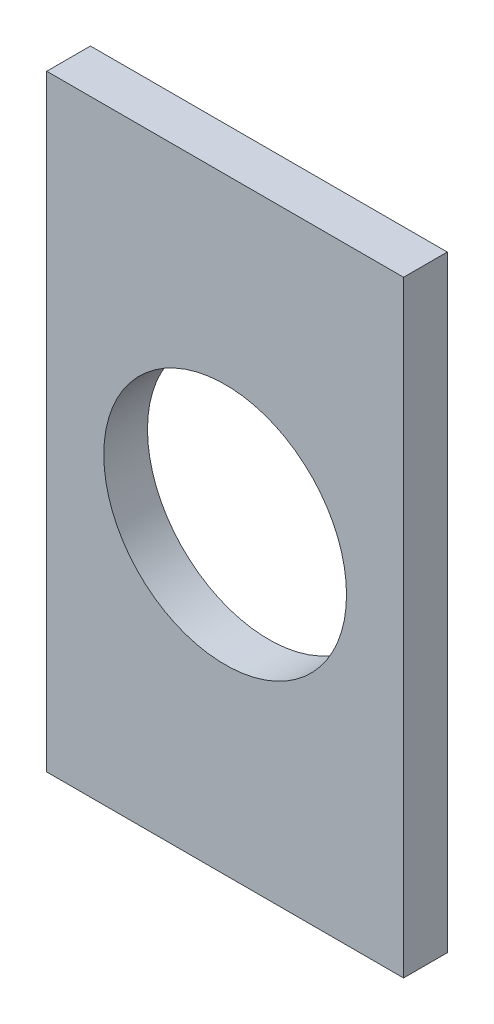
ISO-10303-21;
HEADER;
FILE_DESCRIPTION(('STEP AP214'),'2;1');
FILE_NAME('part.step','',(''),(''),'','','');
FILE_SCHEMA(('AUTOMOTIVE_DESIGN { 1 0 10303 214 1 1 1 1 }'));
ENDSEC;
DATA;
#1=APPLICATION_CONTEXT('core data for automotive mechanical design processes');
#2=APPLICATION_PROTOCOL_DEFINITION('international standard','automotive_design',2000,#1);
#3=PRODUCT_CONTEXT('',#1,'mechanical');
#4=PRODUCT('Part','Part','',(#3));
#5=PRODUCT_RELATED_PRODUCT_CATEGORY('part','',(#4));
#6=PRODUCT_DEFINITION_FORMATION('','',#4);
#7=PRODUCT_DEFINITION_CONTEXT('part definition',#1,'design');
#8=PRODUCT_DEFINITION('design','',#6,#7);
#9=PRODUCT_DEFINITION_SHAPE('','',#8);
#10=(LENGTH_UNIT() NAMED_UNIT(*) SI_UNIT(.MILLI.,.METRE.));
#11=(NAMED_UNIT(*) PLANE_ANGLE_UNIT() SI_UNIT($,.RADIAN.));
#12=(NAMED_UNIT(*) SI_UNIT($,.STERADIAN.) SOLID_ANGLE_UNIT());
#13=UNCERTAINTY_MEASURE_WITH_UNIT(LENGTH_MEASURE(1.E-05),#10,'distance_accuracy_value','');
#14=(GEOMETRIC_REPRESENTATION_CONTEXT(3) GLOBAL_UNCERTAINTY_ASSIGNED_CONTEXT((#13)) GLOBAL_UNIT_ASSIGNED_CONTEXT((#10,
#11,#12)) REPRESENTATION_CONTEXT('',''));
#15=CARTESIAN_POINT('',(0.,0.,0.));
#16=DIRECTION('',(0.,0.,1.));
#17=DIRECTION('',(1.,0.,0.));
#18=AXIS2_PLACEMENT_3D('',#15,#16,#17);
#19=CARTESIAN_POINT('',(0.,0.,0.9));
#20=DIRECTION('',(0.,0.,-1.));
#21=DIRECTION('',(-1.,0.,0.));
#22=AXIS2_PLACEMENT_3D('',#19,#20,#21);
#23=PLANE('',#22);
#24=DIRECTION('',(0.,1.,0.));
#25=VECTOR('',#24,1.);
#26=CARTESIAN_POINT('',(7.35,-12.5,0.9));
#27=LINE('',#26,#25);
#28=CARTESIAN_POINT('',(7.35,-12.5,0.9));
#29=VERTEX_POINT('',#28);
#30=CARTESIAN_POINT('',(7.35,12.5,0.9));
#31=VERTEX_POINT('',#30);
#32=EDGE_CURVE('E89',#29,#31,#27,.T.);
#33=ORIENTED_EDGE('',*,*,#32,.T.);
#34=DIRECTION('',(-1.,0.,0.));
#35=VECTOR('',#34,1.);
#36=CARTESIAN_POINT('',(-7.35,12.5,0.9));
#37=LINE('',#36,#35);
#38=CARTESIAN_POINT('',(-7.35,12.5,0.9));
#39=VERTEX_POINT('',#38);
#40=EDGE_CURVE('E84',#31,#39,#37,.T.);
#41=ORIENTED_EDGE('',*,*,#40,.T.);
#42=DIRECTION('',(0.,-1.,0.));
#43=VECTOR('',#42,1.);
#44=CARTESIAN_POINT('',(-7.35,-12.5,0.9));
#45=LINE('',#44,#43);
#46=CARTESIAN_POINT('',(-7.35,-12.5,0.9));
#47=VERTEX_POINT('',#46);
#48=EDGE_CURVE('E87',#39,#47,#45,.T.);
#49=ORIENTED_EDGE('',*,*,#48,.T.);
#50=DIRECTION('',(1.,0.,0.));
#51=VECTOR('',#50,1.);
#52=CARTESIAN_POINT('',(-7.35,-12.5,0.9));
#53=LINE('',#52,#51);
#54=EDGE_CURVE('E54',#47,#29,#53,.T.);
#55=ORIENTED_EDGE('',*,*,#54,.T.);
#56=EDGE_LOOP('',(#33,#41,#49,#55));
#57=FACE_BOUND('',#56,.T.);
#58=CARTESIAN_POINT('',(0.,0.,0.9));
#59=DIRECTION('',(0.,0.,1.));
#60=DIRECTION('',(1.,0.,0.));
#61=AXIS2_PLACEMENT_3D('',#58,#59,#60);
#62=CIRCLE('',#61,5.);
#63=CARTESIAN_POINT('',(5.,0.,0.9));
#64=VERTEX_POINT('',#63);
#65=EDGE_CURVE('E104',#64,#64,#62,.T.);
#66=ORIENTED_EDGE('',*,*,#65,.F.);
#67=EDGE_LOOP('',(#66));
#68=FACE_BOUND('',#67,.T.);
#69=ADVANCED_FACE('F37',(#57,#68),#23,.F.);
#70=CARTESIAN_POINT('',(0.,0.,-0.9));
#71=DIRECTION('',(0.,0.,-1.));
#72=DIRECTION('',(-1.,0.,0.));
#73=AXIS2_PLACEMENT_3D('',#70,#71,#72);
#74=PLANE('',#73);
#75=DIRECTION('',(0.,1.,0.));
#76=VECTOR('',#75,1.);
#77=CARTESIAN_POINT('',(7.35,-12.5,-0.9));
#78=LINE('',#77,#76);
#79=CARTESIAN_POINT('',(7.35,-12.5,-0.9));
#80=VERTEX_POINT('',#79);
#81=CARTESIAN_POINT('',(7.35,12.5,-0.9));
#82=VERTEX_POINT('',#81);
#83=EDGE_CURVE('E101',#80,#82,#78,.T.);
#84=ORIENTED_EDGE('',*,*,#83,.F.);
#85=DIRECTION('',(1.,0.,0.));
#86=VECTOR('',#85,1.);
#87=CARTESIAN_POINT('',(-7.35,-12.5,-0.9));
#88=LINE('',#87,#86);
#89=CARTESIAN_POINT('',(-7.35,-12.5,-0.9));
#90=VERTEX_POINT('',#89);
#91=EDGE_CURVE('E77',#90,#80,#88,.T.);
#92=ORIENTED_EDGE('',*,*,#91,.F.);
#93=DIRECTION('',(0.,-1.,0.));
#94=VECTOR('',#93,1.);
#95=CARTESIAN_POINT('',(-7.35,-12.5,-0.9));
#96=LINE('',#95,#94);
#97=CARTESIAN_POINT('',(-7.35,12.5,-0.9));
#98=VERTEX_POINT('',#97);
#99=EDGE_CURVE('E71',#98,#90,#96,.T.);
#100=ORIENTED_EDGE('',*,*,#99,.F.);
#101=DIRECTION('',(-1.,0.,0.));
#102=VECTOR('',#101,1.);
#103=CARTESIAN_POINT('',(-7.35,12.5,-0.9));
#104=LINE('',#103,#102);
#105=EDGE_CURVE('E93',#82,#98,#104,.T.);
#106=ORIENTED_EDGE('',*,*,#105,.F.);
#107=EDGE_LOOP('',(#84,#92,#100,#106));
#108=FACE_BOUND('',#107,.T.);
#109=CARTESIAN_POINT('',(0.,0.,-0.9));
#110=DIRECTION('',(0.,0.,1.));
#111=DIRECTION('',(1.,0.,0.));
#112=AXIS2_PLACEMENT_3D('',#109,#110,#111);
#113=CIRCLE('',#112,5.);
#114=CARTESIAN_POINT('',(5.,0.,-0.9));
#115=VERTEX_POINT('',#114);
#116=EDGE_CURVE('E116',#115,#115,#113,.T.);
#117=ORIENTED_EDGE('',*,*,#116,.T.);
#118=EDGE_LOOP('',(#117));
#119=FACE_BOUND('',#118,.T.);
#120=ADVANCED_FACE('F112',(#108,#119),#74,.T.);
#121=CARTESIAN_POINT('',(7.35,-12.5,0.9));
#122=DIRECTION('',(-1.,0.,0.));
#123=DIRECTION('',(0.,0.,1.));
#124=AXIS2_PLACEMENT_3D('',#121,#122,#123);
#125=PLANE('',#124);
#126=ORIENTED_EDGE('',*,*,#83,.T.);
#127=DIRECTION('',(0.,0.,-1.));
#128=VECTOR('',#127,1.);
#129=CARTESIAN_POINT('',(7.35,12.5,0.9));
#130=LINE('',#129,#128);
#131=EDGE_CURVE('E11',#31,#82,#130,.T.);
#132=ORIENTED_EDGE('',*,*,#131,.F.);
#133=ORIENTED_EDGE('',*,*,#32,.F.);
#134=DIRECTION('',(0.,0.,-1.));
#135=VECTOR('',#134,1.);
#136=CARTESIAN_POINT('',(7.35,-12.5,0.9));
#137=LINE('',#136,#135);
#138=EDGE_CURVE('E97',#29,#80,#137,.T.);
#139=ORIENTED_EDGE('',*,*,#138,.T.);
#140=EDGE_LOOP('',(#126,#132,#133,#139));
#141=FACE_BOUND('',#140,.T.);
#142=ADVANCED_FACE('F39',(#141),#125,.F.);
#143=CARTESIAN_POINT('',(-7.35,12.5,0.9));
#144=DIRECTION('',(0.,-1.,0.));
#145=DIRECTION('',(0.,0.,-1.));
#146=AXIS2_PLACEMENT_3D('',#143,#144,#145);
#147=PLANE('',#146);
#148=ORIENTED_EDGE('',*,*,#105,.T.);
#149=DIRECTION('',(0.,0.,-1.));
#150=VECTOR('',#149,1.);
#151=CARTESIAN_POINT('',(-7.35,12.5,0.9));
#152=LINE('',#151,#150);
#153=EDGE_CURVE('E46',#39,#98,#152,.T.);
#154=ORIENTED_EDGE('',*,*,#153,.F.);
#155=ORIENTED_EDGE('',*,*,#40,.F.);
#156=ORIENTED_EDGE('',*,*,#131,.T.);
#157=EDGE_LOOP('',(#148,#154,#155,#156));
#158=FACE_BOUND('',#157,.T.);
#159=ADVANCED_FACE('F92',(#158),#147,.F.);
#160=CARTESIAN_POINT('',(-7.35,-12.5,0.9));
#161=DIRECTION('',(1.,0.,0.));
#162=DIRECTION('',(0.,0.,-1.));
#163=AXIS2_PLACEMENT_3D('',#160,#161,#162);
#164=PLANE('',#163);
#165=ORIENTED_EDGE('',*,*,#99,.T.);
#166=DIRECTION('',(0.,0.,-1.));
#167=VECTOR('',#166,1.);
#168=CARTESIAN_POINT('',(-7.35,-12.5,0.9));
#169=LINE('',#168,#167);
#170=EDGE_CURVE('E94',#47,#90,#169,.T.);
#171=ORIENTED_EDGE('',*,*,#170,.F.);
#172=ORIENTED_EDGE('',*,*,#48,.F.);
#173=ORIENTED_EDGE('',*,*,#153,.T.);
#174=EDGE_LOOP('',(#165,#171,#172,#173));
#175=FACE_BOUND('',#174,.T.);
#176=ADVANCED_FACE('F95',(#175),#164,.F.);
#177=CARTESIAN_POINT('',(-7.35,-12.5,0.9));
#178=DIRECTION('',(0.,1.,0.));
#179=DIRECTION('',(0.,0.,1.));
#180=AXIS2_PLACEMENT_3D('',#177,#178,#179);
#181=PLANE('',#180);
#182=ORIENTED_EDGE('',*,*,#91,.T.);
#183=ORIENTED_EDGE('',*,*,#138,.F.);
#184=ORIENTED_EDGE('',*,*,#54,.F.);
#185=ORIENTED_EDGE('',*,*,#170,.T.);
#186=EDGE_LOOP('',(#182,#183,#184,#185));
#187=FACE_BOUND('',#186,.T.);
#188=ADVANCED_FACE('F109',(#187),#181,.F.);
#189=CARTESIAN_POINT('',(0.,0.,0.9));
#190=DIRECTION('',(0.,0.,-1.));
#191=DIRECTION('',(-1.,0.,0.));
#192=AXIS2_PLACEMENT_3D('',#189,#190,#191);
#193=CYLINDRICAL_SURFACE('',#192,5.);
#194=ORIENTED_EDGE('',*,*,#65,.T.);
#195=EDGE_LOOP('',(#194));
#196=FACE_BOUND('',#195,.T.);
#197=ORIENTED_EDGE('',*,*,#116,.F.);
#198=EDGE_LOOP('',(#197));
#199=FACE_BOUND('',#198,.T.);
#200=ADVANCED_FACE('F122',(#196,#199),#193,.F.);
#201=CLOSED_SHELL('',(#69,#120,#142,#159,#176,#188,#200));
#202=MANIFOLD_SOLID_BREP('B2',#201);
#203=ADVANCED_BREP_SHAPE_REPRESENTATION('',(#18,#202),#14);
#204=SHAPE_DEFINITION_REPRESENTATION(#9,#203);
ENDSEC;
END-ISO-10303-21;
